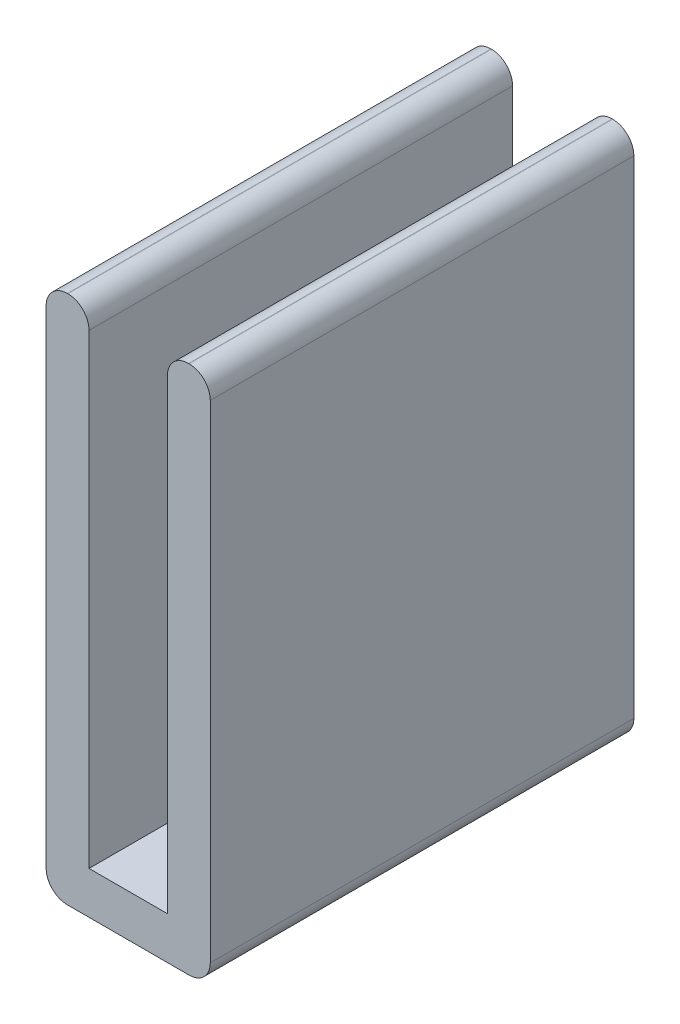
ISO-10303-21;
HEADER;
FILE_DESCRIPTION(('STEP AP214'),'2;1');
FILE_NAME('part.step','',(''),(''),'','','');
FILE_SCHEMA(('AUTOMOTIVE_DESIGN { 1 0 10303 214 1 1 1 1 }'));
ENDSEC;
DATA;
#1=APPLICATION_CONTEXT('core data for automotive mechanical design processes');
#2=APPLICATION_PROTOCOL_DEFINITION('international standard','automotive_design',2000,#1);
#3=PRODUCT_CONTEXT('',#1,'mechanical');
#4=PRODUCT('Part','Part','',(#3));
#5=PRODUCT_RELATED_PRODUCT_CATEGORY('part','',(#4));
#6=PRODUCT_DEFINITION_FORMATION('','',#4);
#7=PRODUCT_DEFINITION_CONTEXT('part definition',#1,'design');
#8=PRODUCT_DEFINITION('design','',#6,#7);
#9=PRODUCT_DEFINITION_SHAPE('','',#8);
#10=(LENGTH_UNIT() NAMED_UNIT(*) SI_UNIT(.MILLI.,.METRE.));
#11=(NAMED_UNIT(*) PLANE_ANGLE_UNIT() SI_UNIT($,.RADIAN.));
#12=(NAMED_UNIT(*) SI_UNIT($,.STERADIAN.) SOLID_ANGLE_UNIT());
#13=UNCERTAINTY_MEASURE_WITH_UNIT(LENGTH_MEASURE(1.E-05),#10,'distance_accuracy_value','');
#14=(GEOMETRIC_REPRESENTATION_CONTEXT(3) GLOBAL_UNCERTAINTY_ASSIGNED_CONTEXT((#13)) GLOBAL_UNIT_ASSIGNED_CONTEXT((#10,
#11,#12)) REPRESENTATION_CONTEXT('',''));
#15=CARTESIAN_POINT('',(0.,0.,0.));
#16=DIRECTION('',(0.,0.,1.));
#17=DIRECTION('',(1.,0.,0.));
#18=AXIS2_PLACEMENT_3D('',#15,#16,#17);
#19=CARTESIAN_POINT('',(2.29000000000003,9.6,8.));
#20=DIRECTION('',(1.,0.,0.));
#21=DIRECTION('',(0.,0.,-1.));
#22=AXIS2_PLACEMENT_3D('',#19,#20,#21);
#23=PLANE('',#22);
#24=DIRECTION('',(0.,-1.,0.));
#25=VECTOR('',#24,1.);
#26=CARTESIAN_POINT('',(2.29000000000003,9.6,0.));
#27=LINE('',#26,#25);
#28=CARTESIAN_POINT('',(2.29000000000003,9.6,0.));
#29=VERTEX_POINT('',#28);
#30=CARTESIAN_POINT('',(2.29000000000003,0.800000000000002,0.));
#31=VERTEX_POINT('',#30);
#32=EDGE_CURVE('E176',#29,#31,#27,.T.);
#33=ORIENTED_EDGE('',*,*,#32,.T.);
#34=DIRECTION('',(0.,0.,-1.));
#35=VECTOR('',#34,1.);
#36=CARTESIAN_POINT('',(2.29000000000003,0.800000000000002,8.));
#37=LINE('',#36,#35);
#38=CARTESIAN_POINT('',(2.29000000000003,0.800000000000002,8.));
#39=VERTEX_POINT('',#38);
#40=EDGE_CURVE('E11',#39,#31,#37,.T.);
#41=ORIENTED_EDGE('',*,*,#40,.F.);
#42=DIRECTION('',(0.,-1.,0.));
#43=VECTOR('',#42,1.);
#44=CARTESIAN_POINT('',(2.29000000000003,9.6,8.));
#45=LINE('',#44,#43);
#46=CARTESIAN_POINT('',(2.29000000000003,9.6,8.));
#47=VERTEX_POINT('',#46);
#48=EDGE_CURVE('E216',#47,#39,#45,.T.);
#49=ORIENTED_EDGE('',*,*,#48,.F.);
#50=DIRECTION('',(0.,0.,-1.));
#51=VECTOR('',#50,1.);
#52=CARTESIAN_POINT('',(2.29000000000003,9.6,8.));
#53=LINE('',#52,#51);
#54=EDGE_CURVE('E172',#47,#29,#53,.T.);
#55=ORIENTED_EDGE('',*,*,#54,.T.);
#56=EDGE_LOOP('',(#33,#41,#49,#55));
#57=FACE_BOUND('',#56,.T.);
#58=ADVANCED_FACE('F39',(#57),#23,.F.);
#59=CARTESIAN_POINT('',(0.810000000000028,0.800000000000002,8.));
#60=DIRECTION('',(0.,-1.,0.));
#61=DIRECTION('',(0.,0.,-1.));
#62=AXIS2_PLACEMENT_3D('',#59,#60,#61);
#63=PLANE('',#62);
#64=DIRECTION('',(-1.,0.,0.));
#65=VECTOR('',#64,1.);
#66=CARTESIAN_POINT('',(0.810000000000028,0.800000000000002,0.));
#67=LINE('',#66,#65);
#68=CARTESIAN_POINT('',(0.810000000000028,0.800000000000002,0.));
#69=VERTEX_POINT('',#68);
#70=EDGE_CURVE('E180',#31,#69,#67,.T.);
#71=ORIENTED_EDGE('',*,*,#70,.T.);
#72=DIRECTION('',(0.,0.,-1.));
#73=VECTOR('',#72,1.);
#74=CARTESIAN_POINT('',(0.810000000000028,0.800000000000002,8.));
#75=LINE('',#74,#73);
#76=CARTESIAN_POINT('',(0.810000000000028,0.800000000000002,8.));
#77=VERTEX_POINT('',#76);
#78=EDGE_CURVE('E48',#77,#69,#75,.T.);
#79=ORIENTED_EDGE('',*,*,#78,.F.);
#80=DIRECTION('',(-1.,0.,0.));
#81=VECTOR('',#80,1.);
#82=CARTESIAN_POINT('',(0.810000000000028,0.800000000000002,8.));
#83=LINE('',#82,#81);
#84=EDGE_CURVE('E117',#39,#77,#83,.T.);
#85=ORIENTED_EDGE('',*,*,#84,.F.);
#86=ORIENTED_EDGE('',*,*,#40,.T.);
#87=EDGE_LOOP('',(#71,#79,#85,#86));
#88=FACE_BOUND('',#87,.T.);
#89=ADVANCED_FACE('F324',(#88),#63,.F.);
#90=CARTESIAN_POINT('',(0.810000000000026,9.6,8.));
#91=DIRECTION('',(-1.,0.,0.));
#92=DIRECTION('',(0.,-1.,0.));
#93=AXIS2_PLACEMENT_3D('',#90,#91,#92);
#94=PLANE('',#93);
#95=DIRECTION('',(0.,1.,0.));
#96=VECTOR('',#95,1.);
#97=CARTESIAN_POINT('',(0.810000000000026,9.6,0.));
#98=LINE('',#97,#96);
#99=CARTESIAN_POINT('',(0.810000000000026,9.6,0.));
#100=VERTEX_POINT('',#99);
#101=EDGE_CURVE('E183',#69,#100,#98,.T.);
#102=ORIENTED_EDGE('',*,*,#101,.T.);
#103=DIRECTION('',(0.,0.,-1.));
#104=VECTOR('',#103,1.);
#105=CARTESIAN_POINT('',(0.810000000000026,9.6,8.));
#106=LINE('',#105,#104);
#107=CARTESIAN_POINT('',(0.810000000000026,9.6,8.));
#108=VERTEX_POINT('',#107);
#109=EDGE_CURVE('E251',#108,#100,#106,.T.);
#110=ORIENTED_EDGE('',*,*,#109,.F.);
#111=DIRECTION('',(0.,1.,0.));
#112=VECTOR('',#111,1.);
#113=CARTESIAN_POINT('',(0.810000000000026,9.6,8.));
#114=LINE('',#113,#112);
#115=EDGE_CURVE('E261',#77,#108,#114,.T.);
#116=ORIENTED_EDGE('',*,*,#115,.F.);
#117=ORIENTED_EDGE('',*,*,#78,.T.);
#118=EDGE_LOOP('',(#102,#110,#116,#117));
#119=FACE_BOUND('',#118,.T.);
#120=ADVANCED_FACE('F259',(#119),#94,.F.);
#121=CARTESIAN_POINT('',(0.410000000000026,9.6,8.));
#122=DIRECTION('',(0.,0.,-1.));
#123=DIRECTION('',(-1.,0.,0.));
#124=AXIS2_PLACEMENT_3D('',#121,#122,#123);
#125=CYLINDRICAL_SURFACE('',#124,0.4);
#126=CARTESIAN_POINT('',(0.410000000000026,9.6,0.));
#127=DIRECTION('',(0.,0.,1.));
#128=DIRECTION('',(-1.,0.,0.));
#129=AXIS2_PLACEMENT_3D('',#126,#127,#128);
#130=CIRCLE('',#129,0.4);
#131=CARTESIAN_POINT('',(0.410000000000023,10.,0.));
#132=VERTEX_POINT('',#131);
#133=EDGE_CURVE('E186',#100,#132,#130,.T.);
#134=ORIENTED_EDGE('',*,*,#133,.T.);
#135=DIRECTION('',(0.,0.,-1.));
#136=VECTOR('',#135,1.);
#137=CARTESIAN_POINT('',(0.410000000000023,10.,8.));
#138=LINE('',#137,#136);
#139=CARTESIAN_POINT('',(0.410000000000023,10.,8.));
#140=VERTEX_POINT('',#139);
#141=EDGE_CURVE('E247',#140,#132,#138,.T.);
#142=ORIENTED_EDGE('',*,*,#141,.F.);
#143=CARTESIAN_POINT('',(0.410000000000026,9.6,8.));
#144=DIRECTION('',(0.,0.,1.));
#145=DIRECTION('',(-1.,0.,0.));
#146=AXIS2_PLACEMENT_3D('',#143,#144,#145);
#147=CIRCLE('',#146,0.4);
#148=EDGE_CURVE('E280',#108,#140,#147,.T.);
#149=ORIENTED_EDGE('',*,*,#148,.F.);
#150=ORIENTED_EDGE('',*,*,#109,.T.);
#151=EDGE_LOOP('',(#134,#142,#149,#150));
#152=FACE_BOUND('',#151,.T.);
#153=ADVANCED_FACE('F270',(#152),#125,.T.);
#154=CARTESIAN_POINT('',(0.400000000000003,10.,8.));
#155=DIRECTION('',(0.,-1.,0.));
#156=DIRECTION('',(0.,0.,-1.));
#157=AXIS2_PLACEMENT_3D('',#154,#155,#156);
#158=PLANE('',#157);
#159=DIRECTION('',(-1.,0.,0.));
#160=VECTOR('',#159,1.);
#161=CARTESIAN_POINT('',(0.400000000000003,10.,0.));
#162=LINE('',#161,#160);
#163=CARTESIAN_POINT('',(0.400000000000003,10.,0.));
#164=VERTEX_POINT('',#163);
#165=EDGE_CURVE('E189',#132,#164,#162,.T.);
#166=ORIENTED_EDGE('',*,*,#165,.T.);
#167=DIRECTION('',(0.,0.,-1.));
#168=VECTOR('',#167,1.);
#169=CARTESIAN_POINT('',(0.400000000000003,10.,8.));
#170=LINE('',#169,#168);
#171=CARTESIAN_POINT('',(0.400000000000003,10.,8.));
#172=VERTEX_POINT('',#171);
#173=EDGE_CURVE('E243',#172,#164,#170,.T.);
#174=ORIENTED_EDGE('',*,*,#173,.F.);
#175=DIRECTION('',(-1.,0.,0.));
#176=VECTOR('',#175,1.);
#177=CARTESIAN_POINT('',(0.400000000000003,10.,8.));
#178=LINE('',#177,#176);
#179=EDGE_CURVE('E276',#140,#172,#178,.T.);
#180=ORIENTED_EDGE('',*,*,#179,.F.);
#181=ORIENTED_EDGE('',*,*,#141,.T.);
#182=EDGE_LOOP('',(#166,#174,#180,#181));
#183=FACE_BOUND('',#182,.T.);
#184=ADVANCED_FACE('F274',(#183),#158,.F.);
#185=CARTESIAN_POINT('',(0.4,9.6,8.));
#186=DIRECTION('',(0.,0.,-1.));
#187=DIRECTION('',(-1.,0.,0.));
#188=AXIS2_PLACEMENT_3D('',#185,#186,#187);
#189=CYLINDRICAL_SURFACE('',#188,0.4);
#190=CARTESIAN_POINT('',(0.4,9.6,0.));
#191=DIRECTION('',(0.,0.,1.));
#192=DIRECTION('',(-1.,0.,0.));
#193=AXIS2_PLACEMENT_3D('',#190,#191,#192);
#194=CIRCLE('',#193,0.4);
#195=CARTESIAN_POINT('',(0.,9.6,0.));
#196=VERTEX_POINT('',#195);
#197=EDGE_CURVE('E192',#164,#196,#194,.T.);
#198=ORIENTED_EDGE('',*,*,#197,.T.);
#199=DIRECTION('',(0.,0.,-1.));
#200=VECTOR('',#199,1.);
#201=CARTESIAN_POINT('',(0.,9.6,8.));
#202=LINE('',#201,#200);
#203=CARTESIAN_POINT('',(0.,9.6,8.));
#204=VERTEX_POINT('',#203);
#205=EDGE_CURVE('E239',#204,#196,#202,.T.);
#206=ORIENTED_EDGE('',*,*,#205,.F.);
#207=CARTESIAN_POINT('',(0.4,9.6,8.));
#208=DIRECTION('',(0.,0.,1.));
#209=DIRECTION('',(-1.,0.,0.));
#210=AXIS2_PLACEMENT_3D('',#207,#208,#209);
#211=CIRCLE('',#210,0.4);
#212=EDGE_CURVE('E279',#172,#204,#211,.T.);
#213=ORIENTED_EDGE('',*,*,#212,.F.);
#214=ORIENTED_EDGE('',*,*,#173,.T.);
#215=EDGE_LOOP('',(#198,#206,#213,#214));
#216=FACE_BOUND('',#215,.T.);
#217=ADVANCED_FACE('F337',(#216),#189,.T.);
#218=CARTESIAN_POINT('',(0.,0.400000000000003,8.));
#219=DIRECTION('',(1.,0.,0.));
#220=DIRECTION('',(0.,0.,-1.));
#221=AXIS2_PLACEMENT_3D('',#218,#219,#220);
#222=PLANE('',#221);
#223=DIRECTION('',(0.,-1.,0.));
#224=VECTOR('',#223,1.);
#225=CARTESIAN_POINT('',(0.,0.400000000000003,0.));
#226=LINE('',#225,#224);
#227=CARTESIAN_POINT('',(0.,0.400000000000003,0.));
#228=VERTEX_POINT('',#227);
#229=EDGE_CURVE('E195',#196,#228,#226,.T.);
#230=ORIENTED_EDGE('',*,*,#229,.T.);
#231=DIRECTION('',(0.,0.,-1.));
#232=VECTOR('',#231,1.);
#233=CARTESIAN_POINT('',(0.,0.400000000000003,8.));
#234=LINE('',#233,#232);
#235=CARTESIAN_POINT('',(0.,0.400000000000003,8.));
#236=VERTEX_POINT('',#235);
#237=EDGE_CURVE('E235',#236,#228,#234,.T.);
#238=ORIENTED_EDGE('',*,*,#237,.F.);
#239=DIRECTION('',(0.,-1.,0.));
#240=VECTOR('',#239,1.);
#241=CARTESIAN_POINT('',(0.,0.400000000000003,8.));
#242=LINE('',#241,#240);
#243=EDGE_CURVE('E284',#204,#236,#242,.T.);
#244=ORIENTED_EDGE('',*,*,#243,.F.);
#245=ORIENTED_EDGE('',*,*,#205,.T.);
#246=EDGE_LOOP('',(#230,#238,#244,#245));
#247=FACE_BOUND('',#246,.T.);
#248=ADVANCED_FACE('F340',(#247),#222,.F.);
#249=CARTESIAN_POINT('',(0.4,0.4,8.));
#250=DIRECTION('',(0.,0.,-1.));
#251=DIRECTION('',(-1.,0.,0.));
#252=AXIS2_PLACEMENT_3D('',#249,#250,#251);
#253=CYLINDRICAL_SURFACE('',#252,0.4);
#254=CARTESIAN_POINT('',(0.4,0.4,0.));
#255=DIRECTION('',(0.,0.,1.));
#256=DIRECTION('',(-1.,0.,0.));
#257=AXIS2_PLACEMENT_3D('',#254,#255,#256);
#258=CIRCLE('',#257,0.4);
#259=CARTESIAN_POINT('',(0.400000000000003,0.,0.));
#260=VERTEX_POINT('',#259);
#261=EDGE_CURVE('E198',#228,#260,#258,.T.);
#262=ORIENTED_EDGE('',*,*,#261,.T.);
#263=DIRECTION('',(0.,0.,-1.));
#264=VECTOR('',#263,1.);
#265=CARTESIAN_POINT('',(0.400000000000003,0.,8.));
#266=LINE('',#265,#264);
#267=CARTESIAN_POINT('',(0.400000000000003,0.,8.));
#268=VERTEX_POINT('',#267);
#269=EDGE_CURVE('E231',#268,#260,#266,.T.);
#270=ORIENTED_EDGE('',*,*,#269,.F.);
#271=CARTESIAN_POINT('',(0.4,0.4,8.));
#272=DIRECTION('',(0.,0.,1.));
#273=DIRECTION('',(-1.,0.,0.));
#274=AXIS2_PLACEMENT_3D('',#271,#272,#273);
#275=CIRCLE('',#274,0.4);
#276=EDGE_CURVE('E291',#236,#268,#275,.T.);
#277=ORIENTED_EDGE('',*,*,#276,.F.);
#278=ORIENTED_EDGE('',*,*,#237,.T.);
#279=EDGE_LOOP('',(#262,#270,#277,#278));
#280=FACE_BOUND('',#279,.T.);
#281=ADVANCED_FACE('F344',(#280),#253,.T.);
#282=CARTESIAN_POINT('',(0.400000000000003,0.,8.));
#283=DIRECTION('',(0.,1.,0.));
#284=DIRECTION('',(0.,0.,1.));
#285=AXIS2_PLACEMENT_3D('',#282,#283,#284);
#286=PLANE('',#285);
#287=DIRECTION('',(1.,0.,0.));
#288=VECTOR('',#287,1.);
#289=CARTESIAN_POINT('',(0.400000000000003,0.,0.));
#290=LINE('',#289,#288);
#291=CARTESIAN_POINT('',(2.7,0.,0.));
#292=VERTEX_POINT('',#291);
#293=EDGE_CURVE('E201',#260,#292,#290,.T.);
#294=ORIENTED_EDGE('',*,*,#293,.T.);
#295=DIRECTION('',(0.,0.,-1.));
#296=VECTOR('',#295,1.);
#297=CARTESIAN_POINT('',(2.7,0.,8.));
#298=LINE('',#297,#296);
#299=CARTESIAN_POINT('',(2.7,0.,8.));
#300=VERTEX_POINT('',#299);
#301=EDGE_CURVE('E227',#300,#292,#298,.T.);
#302=ORIENTED_EDGE('',*,*,#301,.F.);
#303=DIRECTION('',(1.,0.,0.));
#304=VECTOR('',#303,1.);
#305=CARTESIAN_POINT('',(0.400000000000003,0.,8.));
#306=LINE('',#305,#304);
#307=EDGE_CURVE('E294',#268,#300,#306,.T.);
#308=ORIENTED_EDGE('',*,*,#307,.F.);
#309=ORIENTED_EDGE('',*,*,#269,.T.);
#310=EDGE_LOOP('',(#294,#302,#308,#309));
#311=FACE_BOUND('',#310,.T.);
#312=ADVANCED_FACE('F348',(#311),#286,.F.);
#313=CARTESIAN_POINT('',(2.7,0.4,8.));
#314=DIRECTION('',(0.,0.,-1.));
#315=DIRECTION('',(-1.,0.,0.));
#316=AXIS2_PLACEMENT_3D('',#313,#314,#315);
#317=CYLINDRICAL_SURFACE('',#316,0.4);
#318=CARTESIAN_POINT('',(2.7,0.4,0.));
#319=DIRECTION('',(0.,0.,1.));
#320=DIRECTION('',(1.,0.,0.));
#321=AXIS2_PLACEMENT_3D('',#318,#319,#320);
#322=CIRCLE('',#321,0.4);
#323=CARTESIAN_POINT('',(3.1,0.4,0.));
#324=VERTEX_POINT('',#323);
#325=EDGE_CURVE('E204',#292,#324,#322,.T.);
#326=ORIENTED_EDGE('',*,*,#325,.T.);
#327=DIRECTION('',(0.,0.,-1.));
#328=VECTOR('',#327,1.);
#329=CARTESIAN_POINT('',(3.1,0.4,8.));
#330=LINE('',#329,#328);
#331=CARTESIAN_POINT('',(3.1,0.4,8.));
#332=VERTEX_POINT('',#331);
#333=EDGE_CURVE('E223',#332,#324,#330,.T.);
#334=ORIENTED_EDGE('',*,*,#333,.F.);
#335=CARTESIAN_POINT('',(2.7,0.4,8.));
#336=DIRECTION('',(0.,0.,1.));
#337=DIRECTION('',(1.,0.,0.));
#338=AXIS2_PLACEMENT_3D('',#335,#336,#337);
#339=CIRCLE('',#338,0.4);
#340=EDGE_CURVE('E297',#300,#332,#339,.T.);
#341=ORIENTED_EDGE('',*,*,#340,.F.);
#342=ORIENTED_EDGE('',*,*,#301,.T.);
#343=EDGE_LOOP('',(#326,#334,#341,#342));
#344=FACE_BOUND('',#343,.T.);
#345=ADVANCED_FACE('F305',(#344),#317,.T.);
#346=CARTESIAN_POINT('',(3.1,0.400000000000003,8.));
#347=DIRECTION('',(-1.,0.,0.));
#348=DIRECTION('',(0.,0.,1.));
#349=AXIS2_PLACEMENT_3D('',#346,#347,#348);
#350=PLANE('',#349);
#351=DIRECTION('',(0.,1.,0.));
#352=VECTOR('',#351,1.);
#353=CARTESIAN_POINT('',(3.1,0.400000000000003,0.));
#354=LINE('',#353,#352);
#355=CARTESIAN_POINT('',(3.1,9.6,0.));
#356=VERTEX_POINT('',#355);
#357=EDGE_CURVE('E207',#324,#356,#354,.T.);
#358=ORIENTED_EDGE('',*,*,#357,.T.);
#359=DIRECTION('',(0.,0.,-1.));
#360=VECTOR('',#359,1.);
#361=CARTESIAN_POINT('',(3.1,9.6,8.));
#362=LINE('',#361,#360);
#363=CARTESIAN_POINT('',(3.1,9.6,8.));
#364=VERTEX_POINT('',#363);
#365=EDGE_CURVE('E165',#364,#356,#362,.T.);
#366=ORIENTED_EDGE('',*,*,#365,.F.);
#367=DIRECTION('',(0.,1.,0.));
#368=VECTOR('',#367,1.);
#369=CARTESIAN_POINT('',(3.1,0.400000000000003,8.));
#370=LINE('',#369,#368);
#371=EDGE_CURVE('E154',#332,#364,#370,.T.);
#372=ORIENTED_EDGE('',*,*,#371,.F.);
#373=ORIENTED_EDGE('',*,*,#333,.T.);
#374=EDGE_LOOP('',(#358,#366,#372,#373));
#375=FACE_BOUND('',#374,.T.);
#376=ADVANCED_FACE('F309',(#375),#350,.F.);
#377=CARTESIAN_POINT('',(2.7,9.6,8.));
#378=DIRECTION('',(0.,0.,-1.));
#379=DIRECTION('',(-1.,0.,0.));
#380=AXIS2_PLACEMENT_3D('',#377,#378,#379);
#381=CYLINDRICAL_SURFACE('',#380,0.4);
#382=CARTESIAN_POINT('',(2.7,9.6,0.));
#383=DIRECTION('',(0.,0.,1.));
#384=DIRECTION('',(-1.,0.,0.));
#385=AXIS2_PLACEMENT_3D('',#382,#383,#384);
#386=CIRCLE('',#385,0.4);
#387=CARTESIAN_POINT('',(2.7,10.,0.));
#388=VERTEX_POINT('',#387);
#389=EDGE_CURVE('E163',#356,#388,#386,.T.);
#390=ORIENTED_EDGE('',*,*,#389,.T.);
#391=DIRECTION('',(0.,0.,-1.));
#392=VECTOR('',#391,1.);
#393=CARTESIAN_POINT('',(2.7,10.,8.));
#394=LINE('',#393,#392);
#395=CARTESIAN_POINT('',(2.7,10.,8.));
#396=VERTEX_POINT('',#395);
#397=EDGE_CURVE('E160',#396,#388,#394,.T.);
#398=ORIENTED_EDGE('',*,*,#397,.F.);
#399=CARTESIAN_POINT('',(2.7,9.6,8.));
#400=DIRECTION('',(0.,0.,1.));
#401=DIRECTION('',(-1.,0.,0.));
#402=AXIS2_PLACEMENT_3D('',#399,#400,#401);
#403=CIRCLE('',#402,0.4);
#404=EDGE_CURVE('E148',#364,#396,#403,.T.);
#405=ORIENTED_EDGE('',*,*,#404,.F.);
#406=ORIENTED_EDGE('',*,*,#365,.T.);
#407=EDGE_LOOP('',(#390,#398,#405,#406));
#408=FACE_BOUND('',#407,.T.);
#409=ADVANCED_FACE('F161',(#408),#381,.T.);
#410=CARTESIAN_POINT('',(2.69000000000003,10.,8.));
#411=DIRECTION('',(0.,-1.,0.));
#412=DIRECTION('',(0.,0.,-1.));
#413=AXIS2_PLACEMENT_3D('',#410,#411,#412);
#414=PLANE('',#413);
#415=DIRECTION('',(-1.,0.,0.));
#416=VECTOR('',#415,1.);
#417=CARTESIAN_POINT('',(2.69000000000003,10.,0.));
#418=LINE('',#417,#416);
#419=CARTESIAN_POINT('',(2.69000000000003,10.,0.));
#420=VERTEX_POINT('',#419);
#421=EDGE_CURVE('E103',#388,#420,#418,.T.);
#422=ORIENTED_EDGE('',*,*,#421,.T.);
#423=DIRECTION('',(0.,0.,-1.));
#424=VECTOR('',#423,1.);
#425=CARTESIAN_POINT('',(2.69000000000003,10.,8.));
#426=LINE('',#425,#424);
#427=CARTESIAN_POINT('',(2.69000000000003,10.,8.));
#428=VERTEX_POINT('',#427);
#429=EDGE_CURVE('E166',#428,#420,#426,.T.);
#430=ORIENTED_EDGE('',*,*,#429,.F.);
#431=DIRECTION('',(-1.,0.,0.));
#432=VECTOR('',#431,1.);
#433=CARTESIAN_POINT('',(2.69000000000003,10.,8.));
#434=LINE('',#433,#432);
#435=EDGE_CURVE('E152',#396,#428,#434,.T.);
#436=ORIENTED_EDGE('',*,*,#435,.F.);
#437=ORIENTED_EDGE('',*,*,#397,.T.);
#438=EDGE_LOOP('',(#422,#430,#436,#437));
#439=FACE_BOUND('',#438,.T.);
#440=ADVANCED_FACE('F168',(#439),#414,.F.);
#441=CARTESIAN_POINT('',(2.69000000000003,9.6,8.));
#442=DIRECTION('',(0.,0.,-1.));
#443=DIRECTION('',(-1.,0.,0.));
#444=AXIS2_PLACEMENT_3D('',#441,#442,#443);
#445=CYLINDRICAL_SURFACE('',#444,0.4);
#446=CARTESIAN_POINT('',(2.69000000000003,9.6,0.));
#447=DIRECTION('',(0.,0.,1.));
#448=DIRECTION('',(1.,0.,0.));
#449=AXIS2_PLACEMENT_3D('',#446,#447,#448);
#450=CIRCLE('',#449,0.4);
#451=EDGE_CURVE('E109',#420,#29,#450,.T.);
#452=ORIENTED_EDGE('',*,*,#451,.T.);
#453=ORIENTED_EDGE('',*,*,#54,.F.);
#454=CARTESIAN_POINT('',(2.69000000000003,9.6,8.));
#455=DIRECTION('',(0.,0.,1.));
#456=DIRECTION('',(1.,0.,0.));
#457=AXIS2_PLACEMENT_3D('',#454,#455,#456);
#458=CIRCLE('',#457,0.4);
#459=EDGE_CURVE('E56',#428,#47,#458,.T.);
#460=ORIENTED_EDGE('',*,*,#459,.F.);
#461=ORIENTED_EDGE('',*,*,#429,.T.);
#462=EDGE_LOOP('',(#452,#453,#460,#461));
#463=FACE_BOUND('',#462,.T.);
#464=ADVANCED_FACE('F313',(#463),#445,.T.);
#465=CARTESIAN_POINT('',(0.410000000000026,9.6,8.));
#466=DIRECTION('',(0.,0.,-1.));
#467=DIRECTION('',(-1.,0.,0.));
#468=AXIS2_PLACEMENT_3D('',#465,#466,#467);
#469=PLANE('',#468);
#470=ORIENTED_EDGE('',*,*,#48,.T.);
#471=ORIENTED_EDGE('',*,*,#84,.T.);
#472=ORIENTED_EDGE('',*,*,#115,.T.);
#473=ORIENTED_EDGE('',*,*,#148,.T.);
#474=ORIENTED_EDGE('',*,*,#179,.T.);
#475=ORIENTED_EDGE('',*,*,#212,.T.);
#476=ORIENTED_EDGE('',*,*,#243,.T.);
#477=ORIENTED_EDGE('',*,*,#276,.T.);
#478=ORIENTED_EDGE('',*,*,#307,.T.);
#479=ORIENTED_EDGE('',*,*,#340,.T.);
#480=ORIENTED_EDGE('',*,*,#371,.T.);
#481=ORIENTED_EDGE('',*,*,#404,.T.);
#482=ORIENTED_EDGE('',*,*,#435,.T.);
#483=ORIENTED_EDGE('',*,*,#459,.T.);
#484=EDGE_LOOP('',(#470,#471,#472,#473,#474,#475,#476,#477,#478,#479,#480,#481,#482,#483));
#485=FACE_BOUND('',#484,.T.);
#486=ADVANCED_FACE('F150',(#485),#469,.F.);
#487=CARTESIAN_POINT('',(0.410000000000026,9.6,0.));
#488=DIRECTION('',(0.,0.,-1.));
#489=DIRECTION('',(-1.,0.,0.));
#490=AXIS2_PLACEMENT_3D('',#487,#488,#489);
#491=PLANE('',#490);
#492=ORIENTED_EDGE('',*,*,#32,.F.);
#493=ORIENTED_EDGE('',*,*,#451,.F.);
#494=ORIENTED_EDGE('',*,*,#421,.F.);
#495=ORIENTED_EDGE('',*,*,#389,.F.);
#496=ORIENTED_EDGE('',*,*,#357,.F.);
#497=ORIENTED_EDGE('',*,*,#325,.F.);
#498=ORIENTED_EDGE('',*,*,#293,.F.);
#499=ORIENTED_EDGE('',*,*,#261,.F.);
#500=ORIENTED_EDGE('',*,*,#229,.F.);
#501=ORIENTED_EDGE('',*,*,#197,.F.);
#502=ORIENTED_EDGE('',*,*,#165,.F.);
#503=ORIENTED_EDGE('',*,*,#133,.F.);
#504=ORIENTED_EDGE('',*,*,#101,.F.);
#505=ORIENTED_EDGE('',*,*,#70,.F.);
#506=EDGE_LOOP('',(#492,#493,#494,#495,#496,#497,#498,#499,#500,#501,#502,#503,#504,#505));
#507=FACE_BOUND('',#506,.T.);
#508=ADVANCED_FACE('F265',(#507),#491,.T.);
#509=CLOSED_SHELL('',(#58,#89,#120,#153,#184,#217,#248,#281,#312,#345,#376,#409,#440,#464,#486,#508));
#510=MANIFOLD_SOLID_BREP('B2',#509);
#511=ADVANCED_BREP_SHAPE_REPRESENTATION('',(#18,#510),#14);
#512=SHAPE_DEFINITION_REPRESENTATION(#9,#511);
ENDSEC;
END-ISO-10303-21;
